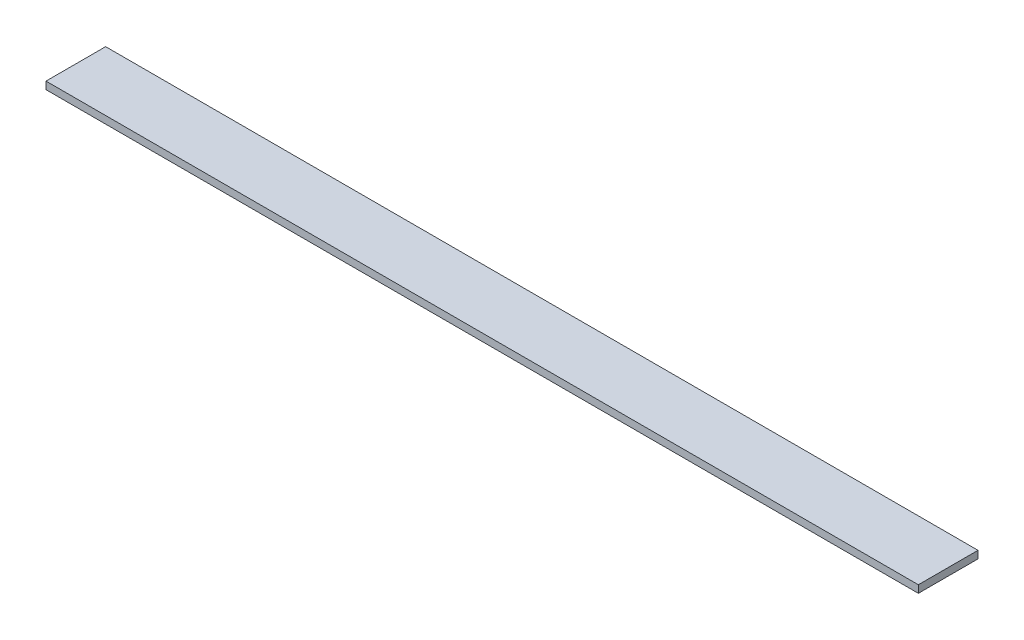
ISO-10303-21;
HEADER;
FILE_DESCRIPTION(('STEP AP214'),'2;1');
FILE_NAME('part.step','',(''),(''),'','','');
FILE_SCHEMA(('AUTOMOTIVE_DESIGN { 1 0 10303 214 1 1 1 1 }'));
ENDSEC;
DATA;
#1=APPLICATION_CONTEXT('core data for automotive mechanical design processes');
#2=APPLICATION_PROTOCOL_DEFINITION('international standard','automotive_design',2000,#1);
#3=PRODUCT_CONTEXT('',#1,'mechanical');
#4=PRODUCT('Part','Part','',(#3));
#5=PRODUCT_RELATED_PRODUCT_CATEGORY('part','',(#4));
#6=PRODUCT_DEFINITION_FORMATION('','',#4);
#7=PRODUCT_DEFINITION_CONTEXT('part definition',#1,'design');
#8=PRODUCT_DEFINITION('design','',#6,#7);
#9=PRODUCT_DEFINITION_SHAPE('','',#8);
#10=(LENGTH_UNIT() NAMED_UNIT(*) SI_UNIT(.MILLI.,.METRE.));
#11=(NAMED_UNIT(*) PLANE_ANGLE_UNIT() SI_UNIT($,.RADIAN.));
#12=(NAMED_UNIT(*) SI_UNIT($,.STERADIAN.) SOLID_ANGLE_UNIT());
#13=UNCERTAINTY_MEASURE_WITH_UNIT(LENGTH_MEASURE(1.E-05),#10,'distance_accuracy_value','');
#14=(GEOMETRIC_REPRESENTATION_CONTEXT(3) GLOBAL_UNCERTAINTY_ASSIGNED_CONTEXT((#13)) GLOBAL_UNIT_ASSIGNED_CONTEXT((#10,
#11,#12)) REPRESENTATION_CONTEXT('',''));
#15=CARTESIAN_POINT('',(0.,0.,0.));
#16=DIRECTION('',(0.,0.,1.));
#17=DIRECTION('',(1.,0.,0.));
#18=AXIS2_PLACEMENT_3D('',#15,#16,#17);
#19=CARTESIAN_POINT('',(371.475,6.35,-25.4));
#20=DIRECTION('',(-1.,0.,0.));
#21=DIRECTION('',(0.,0.,1.));
#22=AXIS2_PLACEMENT_3D('',#19,#20,#21);
#23=PLANE('',#22);
#24=DIRECTION('',(0.,0.,-1.));
#25=VECTOR('',#24,1.);
#26=CARTESIAN_POINT('',(371.475,0.,-25.4));
#27=LINE('',#26,#25);
#28=CARTESIAN_POINT('',(371.475,0.,25.4));
#29=VERTEX_POINT('',#28);
#30=CARTESIAN_POINT('',(371.475,0.,-25.4));
#31=VERTEX_POINT('',#30);
#32=EDGE_CURVE('E97',#29,#31,#27,.T.);
#33=ORIENTED_EDGE('',*,*,#32,.T.);
#34=DIRECTION('',(0.,-1.,0.));
#35=VECTOR('',#34,1.);
#36=CARTESIAN_POINT('',(371.475,6.35,-25.4));
#37=LINE('',#36,#35);
#38=CARTESIAN_POINT('',(371.475,6.35,-25.4));
#39=VERTEX_POINT('',#38);
#40=EDGE_CURVE('E11',#39,#31,#37,.T.);
#41=ORIENTED_EDGE('',*,*,#40,.F.);
#42=DIRECTION('',(0.,0.,-1.));
#43=VECTOR('',#42,1.);
#44=CARTESIAN_POINT('',(371.475,6.35,-25.4));
#45=LINE('',#44,#43);
#46=CARTESIAN_POINT('',(371.475,6.35,25.4));
#47=VERTEX_POINT('',#46);
#48=EDGE_CURVE('E85',#47,#39,#45,.T.);
#49=ORIENTED_EDGE('',*,*,#48,.F.);
#50=DIRECTION('',(0.,-1.,0.));
#51=VECTOR('',#50,1.);
#52=CARTESIAN_POINT('',(371.475,6.35,25.4));
#53=LINE('',#52,#51);
#54=EDGE_CURVE('E93',#47,#29,#53,.T.);
#55=ORIENTED_EDGE('',*,*,#54,.T.);
#56=EDGE_LOOP('',(#33,#41,#49,#55));
#57=FACE_BOUND('',#56,.T.);
#58=ADVANCED_FACE('F34',(#57),#23,.F.);
#59=CARTESIAN_POINT('',(-371.475,6.35,-25.4));
#60=DIRECTION('',(0.,0.,1.));
#61=DIRECTION('',(1.,0.,0.));
#62=AXIS2_PLACEMENT_3D('',#59,#60,#61);
#63=PLANE('',#62);
#64=DIRECTION('',(-1.,0.,0.));
#65=VECTOR('',#64,1.);
#66=CARTESIAN_POINT('',(-371.475,0.,-25.4));
#67=LINE('',#66,#65);
#68=CARTESIAN_POINT('',(-371.475,0.,-25.4));
#69=VERTEX_POINT('',#68);
#70=EDGE_CURVE('E89',#31,#69,#67,.T.);
#71=ORIENTED_EDGE('',*,*,#70,.T.);
#72=DIRECTION('',(0.,-1.,0.));
#73=VECTOR('',#72,1.);
#74=CARTESIAN_POINT('',(-371.475,6.35,-25.4));
#75=LINE('',#74,#73);
#76=CARTESIAN_POINT('',(-371.475,6.35,-25.4));
#77=VERTEX_POINT('',#76);
#78=EDGE_CURVE('E42',#77,#69,#75,.T.);
#79=ORIENTED_EDGE('',*,*,#78,.F.);
#80=DIRECTION('',(-1.,0.,0.));
#81=VECTOR('',#80,1.);
#82=CARTESIAN_POINT('',(-371.475,6.35,-25.4));
#83=LINE('',#82,#81);
#84=EDGE_CURVE('E80',#39,#77,#83,.T.);
#85=ORIENTED_EDGE('',*,*,#84,.F.);
#86=ORIENTED_EDGE('',*,*,#40,.T.);
#87=EDGE_LOOP('',(#71,#79,#85,#86));
#88=FACE_BOUND('',#87,.T.);
#89=ADVANCED_FACE('F88',(#88),#63,.F.);
#90=CARTESIAN_POINT('',(-371.475,6.35,-25.4));
#91=DIRECTION('',(1.,0.,0.));
#92=DIRECTION('',(0.,0.,-1.));
#93=AXIS2_PLACEMENT_3D('',#90,#91,#92);
#94=PLANE('',#93);
#95=DIRECTION('',(0.,0.,1.));
#96=VECTOR('',#95,1.);
#97=CARTESIAN_POINT('',(-371.475,0.,-25.4));
#98=LINE('',#97,#96);
#99=CARTESIAN_POINT('',(-371.475,0.,25.4));
#100=VERTEX_POINT('',#99);
#101=EDGE_CURVE('E67',#69,#100,#98,.T.);
#102=ORIENTED_EDGE('',*,*,#101,.T.);
#103=DIRECTION('',(0.,-1.,0.));
#104=VECTOR('',#103,1.);
#105=CARTESIAN_POINT('',(-371.475,6.35,25.4));
#106=LINE('',#105,#104);
#107=CARTESIAN_POINT('',(-371.475,6.35,25.4));
#108=VERTEX_POINT('',#107);
#109=EDGE_CURVE('E90',#108,#100,#106,.T.);
#110=ORIENTED_EDGE('',*,*,#109,.F.);
#111=DIRECTION('',(0.,0.,1.));
#112=VECTOR('',#111,1.);
#113=CARTESIAN_POINT('',(-371.475,6.35,-25.4));
#114=LINE('',#113,#112);
#115=EDGE_CURVE('E83',#77,#108,#114,.T.);
#116=ORIENTED_EDGE('',*,*,#115,.F.);
#117=ORIENTED_EDGE('',*,*,#78,.T.);
#118=EDGE_LOOP('',(#102,#110,#116,#117));
#119=FACE_BOUND('',#118,.T.);
#120=ADVANCED_FACE('F91',(#119),#94,.F.);
#121=CARTESIAN_POINT('',(-371.475,6.35,25.4));
#122=DIRECTION('',(0.,0.,-1.));
#123=DIRECTION('',(-1.,0.,0.));
#124=AXIS2_PLACEMENT_3D('',#121,#122,#123);
#125=PLANE('',#124);
#126=DIRECTION('',(1.,0.,0.));
#127=VECTOR('',#126,1.);
#128=CARTESIAN_POINT('',(-371.475,0.,25.4));
#129=LINE('',#128,#127);
#130=EDGE_CURVE('E73',#100,#29,#129,.T.);
#131=ORIENTED_EDGE('',*,*,#130,.T.);
#132=ORIENTED_EDGE('',*,*,#54,.F.);
#133=DIRECTION('',(1.,0.,0.));
#134=VECTOR('',#133,1.);
#135=CARTESIAN_POINT('',(-371.475,6.35,25.4));
#136=LINE('',#135,#134);
#137=EDGE_CURVE('E50',#108,#47,#136,.T.);
#138=ORIENTED_EDGE('',*,*,#137,.F.);
#139=ORIENTED_EDGE('',*,*,#109,.T.);
#140=EDGE_LOOP('',(#131,#132,#138,#139));
#141=FACE_BOUND('',#140,.T.);
#142=ADVANCED_FACE('F104',(#141),#125,.F.);
#143=CARTESIAN_POINT('',(0.,6.35,0.));
#144=DIRECTION('',(0.,1.,0.));
#145=DIRECTION('',(0.,0.,1.));
#146=AXIS2_PLACEMENT_3D('',#143,#144,#145);
#147=PLANE('',#146);
#148=ORIENTED_EDGE('',*,*,#48,.T.);
#149=ORIENTED_EDGE('',*,*,#84,.T.);
#150=ORIENTED_EDGE('',*,*,#115,.T.);
#151=ORIENTED_EDGE('',*,*,#137,.T.);
#152=EDGE_LOOP('',(#148,#149,#150,#151));
#153=FACE_BOUND('',#152,.T.);
#154=ADVANCED_FACE('F81',(#153),#147,.T.);
#155=CARTESIAN_POINT('',(0.,0.,0.));
#156=DIRECTION('',(0.,1.,0.));
#157=DIRECTION('',(0.,0.,1.));
#158=AXIS2_PLACEMENT_3D('',#155,#156,#157);
#159=PLANE('',#158);
#160=ORIENTED_EDGE('',*,*,#32,.F.);
#161=ORIENTED_EDGE('',*,*,#130,.F.);
#162=ORIENTED_EDGE('',*,*,#101,.F.);
#163=ORIENTED_EDGE('',*,*,#70,.F.);
#164=EDGE_LOOP('',(#160,#161,#162,#163));
#165=FACE_BOUND('',#164,.T.);
#166=ADVANCED_FACE('F107',(#165),#159,.F.);
#167=CLOSED_SHELL('',(#58,#89,#120,#142,#154,#166));
#168=MANIFOLD_SOLID_BREP('B2',#167);
#169=ADVANCED_BREP_SHAPE_REPRESENTATION('',(#18,#168),#14);
#170=SHAPE_DEFINITION_REPRESENTATION(#9,#169);
ENDSEC;
END-ISO-10303-21;
